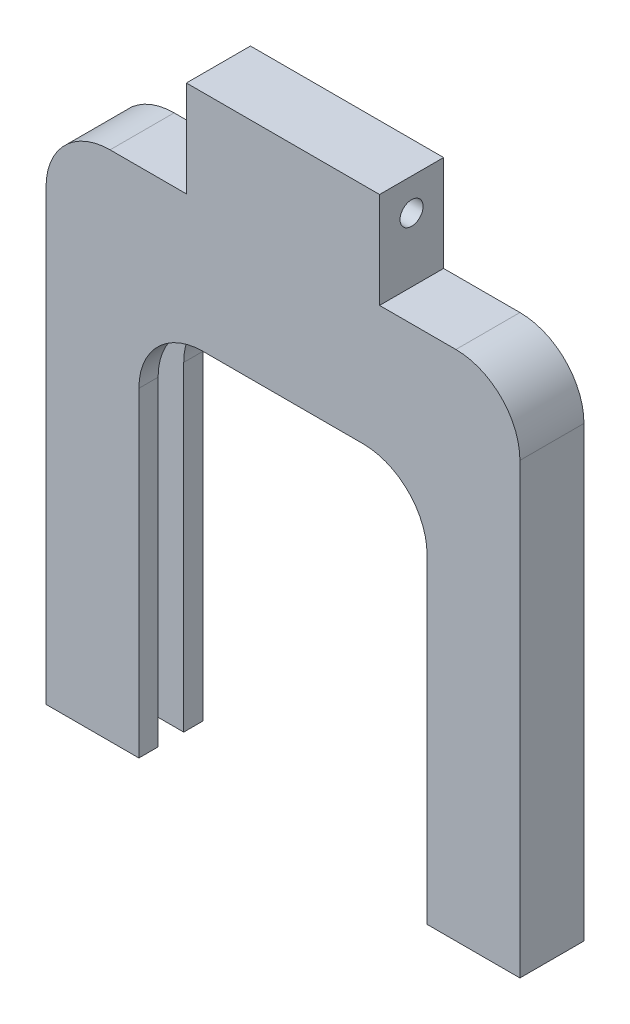
ISO-10303-21;
HEADER;
FILE_DESCRIPTION(('STEP AP214'),'2;1');
FILE_NAME('part.step','',(''),(''),'','','');
FILE_SCHEMA(('AUTOMOTIVE_DESIGN { 1 0 10303 214 1 1 1 1 }'));
ENDSEC;
DATA;
#1=APPLICATION_CONTEXT('core data for automotive mechanical design processes');
#2=APPLICATION_PROTOCOL_DEFINITION('international standard','automotive_design',2000,#1);
#3=PRODUCT_CONTEXT('',#1,'mechanical');
#4=PRODUCT('Part','Part','',(#3));
#5=PRODUCT_RELATED_PRODUCT_CATEGORY('part','',(#4));
#6=PRODUCT_DEFINITION_FORMATION('','',#4);
#7=PRODUCT_DEFINITION_CONTEXT('part definition',#1,'design');
#8=PRODUCT_DEFINITION('design','',#6,#7);
#9=PRODUCT_DEFINITION_SHAPE('','',#8);
#10=(LENGTH_UNIT() NAMED_UNIT(*) SI_UNIT(.MILLI.,.METRE.));
#11=(NAMED_UNIT(*) PLANE_ANGLE_UNIT() SI_UNIT($,.RADIAN.));
#12=(NAMED_UNIT(*) SI_UNIT($,.STERADIAN.) SOLID_ANGLE_UNIT());
#13=UNCERTAINTY_MEASURE_WITH_UNIT(LENGTH_MEASURE(1.E-05),#10,'distance_accuracy_value','');
#14=(GEOMETRIC_REPRESENTATION_CONTEXT(3) GLOBAL_UNCERTAINTY_ASSIGNED_CONTEXT((#13)) GLOBAL_UNIT_ASSIGNED_CONTEXT((#10,
#11,#12)) REPRESENTATION_CONTEXT('',''));
#15=CARTESIAN_POINT('',(0.,0.,0.));
#16=DIRECTION('',(0.,0.,1.));
#17=DIRECTION('',(1.,0.,0.));
#18=AXIS2_PLACEMENT_3D('',#15,#16,#17);
#19=CARTESIAN_POINT('',(12.5,10.,0.));
#20=DIRECTION('',(0.,0.,-1.));
#21=DIRECTION('',(-1.,0.,0.));
#22=AXIS2_PLACEMENT_3D('',#19,#20,#21);
#23=CYLINDRICAL_SURFACE('',#22,10.);
#24=DIRECTION('',(0.,0.,1.));
#25=VECTOR('',#24,1.);
#26=CARTESIAN_POINT('',(12.5,20.,0.));
#27=LINE('',#26,#25);
#28=CARTESIAN_POINT('',(12.5,20.,0.));
#29=VERTEX_POINT('',#28);
#30=CARTESIAN_POINT('',(12.5,20.,3.));
#31=VERTEX_POINT('',#30);
#32=EDGE_CURVE('E389',#29,#31,#27,.T.);
#33=ORIENTED_EDGE('',*,*,#32,.F.);
#34=CARTESIAN_POINT('',(12.5,10.,0.));
#35=DIRECTION('',(0.,0.,1.));
#36=DIRECTION('',(1.,0.,0.));
#37=AXIS2_PLACEMENT_3D('',#34,#35,#36);
#38=CIRCLE('',#37,10.);
#39=CARTESIAN_POINT('',(22.5,10.,0.));
#40=VERTEX_POINT('',#39);
#41=EDGE_CURVE('E44',#29,#40,#38,.F.);
#42=ORIENTED_EDGE('',*,*,#41,.T.);
#43=DIRECTION('',(0.,0.,1.));
#44=VECTOR('',#43,1.);
#45=CARTESIAN_POINT('',(22.5,10.,0.));
#46=LINE('',#45,#44);
#47=CARTESIAN_POINT('',(22.5,10.,3.));
#48=VERTEX_POINT('',#47);
#49=EDGE_CURVE('E392',#48,#40,#46,.F.);
#50=ORIENTED_EDGE('',*,*,#49,.F.);
#51=CARTESIAN_POINT('',(12.5,10.,3.));
#52=DIRECTION('',(0.,0.,-1.));
#53=DIRECTION('',(-1.,0.,0.));
#54=AXIS2_PLACEMENT_3D('',#51,#52,#53);
#55=CIRCLE('',#54,10.);
#56=EDGE_CURVE('E11',#48,#31,#55,.F.);
#57=ORIENTED_EDGE('',*,*,#56,.T.);
#58=EDGE_LOOP('',(#33,#42,#50,#57));
#59=FACE_BOUND('',#58,.T.);
#60=ADVANCED_FACE('F37',(#59),#23,.F.);
#61=CARTESIAN_POINT('',(12.5,10.,0.));
#62=DIRECTION('',(0.,0.,-1.));
#63=DIRECTION('',(-1.,0.,0.));
#64=AXIS2_PLACEMENT_3D('',#61,#62,#63);
#65=CYLINDRICAL_SURFACE('',#64,10.);
#66=DIRECTION('',(0.,0.,1.));
#67=VECTOR('',#66,1.);
#68=CARTESIAN_POINT('',(12.5,20.,0.));
#69=LINE('',#68,#67);
#70=CARTESIAN_POINT('',(12.5,20.,7.));
#71=VERTEX_POINT('',#70);
#72=CARTESIAN_POINT('',(12.5,20.,10.));
#73=VERTEX_POINT('',#72);
#74=EDGE_CURVE('E379',#71,#73,#69,.T.);
#75=ORIENTED_EDGE('',*,*,#74,.F.);
#76=CARTESIAN_POINT('',(12.5,10.,7.));
#77=DIRECTION('',(0.,0.,1.));
#78=DIRECTION('',(1.,0.,0.));
#79=AXIS2_PLACEMENT_3D('',#76,#77,#78);
#80=CIRCLE('',#79,10.);
#81=CARTESIAN_POINT('',(22.5,10.,7.));
#82=VERTEX_POINT('',#81);
#83=EDGE_CURVE('E385',#71,#82,#80,.F.);
#84=ORIENTED_EDGE('',*,*,#83,.T.);
#85=DIRECTION('',(0.,0.,1.));
#86=VECTOR('',#85,1.);
#87=CARTESIAN_POINT('',(22.5,10.,0.));
#88=LINE('',#87,#86);
#89=CARTESIAN_POINT('',(22.5,10.,10.));
#90=VERTEX_POINT('',#89);
#91=EDGE_CURVE('E382',#90,#82,#88,.F.);
#92=ORIENTED_EDGE('',*,*,#91,.F.);
#93=CARTESIAN_POINT('',(12.5,10.,10.));
#94=DIRECTION('',(0.,0.,1.));
#95=DIRECTION('',(1.,0.,0.));
#96=AXIS2_PLACEMENT_3D('',#93,#94,#95);
#97=CIRCLE('',#96,10.);
#98=EDGE_CURVE('E387',#90,#73,#97,.T.);
#99=ORIENTED_EDGE('',*,*,#98,.T.);
#100=EDGE_LOOP('',(#75,#84,#92,#99));
#101=FACE_BOUND('',#100,.T.);
#102=ADVANCED_FACE('F483',(#101),#65,.F.);
#103=CARTESIAN_POINT('',(-12.5,10.,0.));
#104=DIRECTION('',(0.,0.,1.));
#105=DIRECTION('',(1.,0.,0.));
#106=AXIS2_PLACEMENT_3D('',#103,#104,#105);
#107=CYLINDRICAL_SURFACE('',#106,10.);
#108=DIRECTION('',(0.,0.,-1.));
#109=VECTOR('',#108,1.);
#110=CARTESIAN_POINT('',(-12.5,20.,0.));
#111=LINE('',#110,#109);
#112=CARTESIAN_POINT('',(-12.5,20.,3.));
#113=VERTEX_POINT('',#112);
#114=CARTESIAN_POINT('',(-12.5,20.,0.));
#115=VERTEX_POINT('',#114);
#116=EDGE_CURVE('E368',#113,#115,#111,.T.);
#117=ORIENTED_EDGE('',*,*,#116,.F.);
#118=CARTESIAN_POINT('',(-12.5,10.,3.));
#119=DIRECTION('',(0.,0.,-1.));
#120=DIRECTION('',(-1.,0.,0.));
#121=AXIS2_PLACEMENT_3D('',#118,#119,#120);
#122=CIRCLE('',#121,10.);
#123=CARTESIAN_POINT('',(-22.5,9.99999999999999,3.));
#124=VERTEX_POINT('',#123);
#125=EDGE_CURVE('E374',#113,#124,#122,.F.);
#126=ORIENTED_EDGE('',*,*,#125,.T.);
#127=DIRECTION('',(0.,0.,-1.));
#128=VECTOR('',#127,1.);
#129=CARTESIAN_POINT('',(-22.5,9.99999999999999,0.));
#130=LINE('',#129,#128);
#131=CARTESIAN_POINT('',(-22.5,9.99999999999999,0.));
#132=VERTEX_POINT('',#131);
#133=EDGE_CURVE('E371',#132,#124,#130,.F.);
#134=ORIENTED_EDGE('',*,*,#133,.F.);
#135=CARTESIAN_POINT('',(-12.5,10.,0.));
#136=DIRECTION('',(0.,0.,1.));
#137=DIRECTION('',(1.,0.,0.));
#138=AXIS2_PLACEMENT_3D('',#135,#136,#137);
#139=CIRCLE('',#138,10.);
#140=EDGE_CURVE('E376',#132,#115,#139,.F.);
#141=ORIENTED_EDGE('',*,*,#140,.T.);
#142=EDGE_LOOP('',(#117,#126,#134,#141));
#143=FACE_BOUND('',#142,.T.);
#144=ADVANCED_FACE('F432',(#143),#107,.F.);
#145=CARTESIAN_POINT('',(-12.5,10.,0.));
#146=DIRECTION('',(0.,0.,1.));
#147=DIRECTION('',(1.,0.,0.));
#148=AXIS2_PLACEMENT_3D('',#145,#146,#147);
#149=CYLINDRICAL_SURFACE('',#148,10.);
#150=DIRECTION('',(0.,0.,-1.));
#151=VECTOR('',#150,1.);
#152=CARTESIAN_POINT('',(-12.5,20.,0.));
#153=LINE('',#152,#151);
#154=CARTESIAN_POINT('',(-12.5,20.,10.));
#155=VERTEX_POINT('',#154);
#156=CARTESIAN_POINT('',(-12.5,20.,7.));
#157=VERTEX_POINT('',#156);
#158=EDGE_CURVE('E353',#155,#157,#153,.T.);
#159=ORIENTED_EDGE('',*,*,#158,.F.);
#160=CARTESIAN_POINT('',(-12.5,10.,10.));
#161=DIRECTION('',(0.,0.,1.));
#162=DIRECTION('',(1.,0.,0.));
#163=AXIS2_PLACEMENT_3D('',#160,#161,#162);
#164=CIRCLE('',#163,10.);
#165=CARTESIAN_POINT('',(-22.5,9.99999999999999,10.));
#166=VERTEX_POINT('',#165);
#167=EDGE_CURVE('E363',#155,#166,#164,.T.);
#168=ORIENTED_EDGE('',*,*,#167,.T.);
#169=DIRECTION('',(0.,0.,-1.));
#170=VECTOR('',#169,1.);
#171=CARTESIAN_POINT('',(-22.5,9.99999999999999,0.));
#172=LINE('',#171,#170);
#173=CARTESIAN_POINT('',(-22.5,9.99999999999999,7.));
#174=VERTEX_POINT('',#173);
#175=EDGE_CURVE('E360',#174,#166,#172,.F.);
#176=ORIENTED_EDGE('',*,*,#175,.F.);
#177=CARTESIAN_POINT('',(-12.5,10.,7.));
#178=DIRECTION('',(0.,0.,1.));
#179=DIRECTION('',(1.,0.,0.));
#180=AXIS2_PLACEMENT_3D('',#177,#178,#179);
#181=CIRCLE('',#180,10.);
#182=EDGE_CURVE('E365',#174,#157,#181,.F.);
#183=ORIENTED_EDGE('',*,*,#182,.T.);
#184=EDGE_LOOP('',(#159,#168,#176,#183));
#185=FACE_BOUND('',#184,.T.);
#186=ADVANCED_FACE('F491',(#185),#149,.F.);
#187=CARTESIAN_POINT('',(27.,30.,10.));
#188=DIRECTION('',(0.,0.,1.));
#189=DIRECTION('',(1.,0.,0.));
#190=AXIS2_PLACEMENT_3D('',#187,#188,#189);
#191=CYLINDRICAL_SURFACE('',#190,10.);
#192=DIRECTION('',(0.,0.,1.));
#193=VECTOR('',#192,1.);
#194=CARTESIAN_POINT('',(37.,30.,10.));
#195=LINE('',#194,#193);
#196=CARTESIAN_POINT('',(37.,30.,0.));
#197=VERTEX_POINT('',#196);
#198=CARTESIAN_POINT('',(37.,30.,10.));
#199=VERTEX_POINT('',#198);
#200=EDGE_CURVE('E343',#197,#199,#195,.T.);
#201=ORIENTED_EDGE('',*,*,#200,.F.);
#202=CARTESIAN_POINT('',(27.,30.,0.));
#203=DIRECTION('',(0.,0.,1.));
#204=DIRECTION('',(1.,0.,0.));
#205=AXIS2_PLACEMENT_3D('',#202,#203,#204);
#206=CIRCLE('',#205,10.);
#207=CARTESIAN_POINT('',(27.,40.,0.));
#208=VERTEX_POINT('',#207);
#209=EDGE_CURVE('E349',#208,#197,#206,.F.);
#210=ORIENTED_EDGE('',*,*,#209,.F.);
#211=DIRECTION('',(0.,0.,1.));
#212=VECTOR('',#211,1.);
#213=CARTESIAN_POINT('',(27.,40.,10.));
#214=LINE('',#213,#212);
#215=CARTESIAN_POINT('',(27.,40.,10.));
#216=VERTEX_POINT('',#215);
#217=EDGE_CURVE('E346',#216,#208,#214,.F.);
#218=ORIENTED_EDGE('',*,*,#217,.F.);
#219=CARTESIAN_POINT('',(27.,30.,10.));
#220=DIRECTION('',(0.,0.,1.));
#221=DIRECTION('',(1.,0.,0.));
#222=AXIS2_PLACEMENT_3D('',#219,#220,#221);
#223=CIRCLE('',#222,10.);
#224=EDGE_CURVE('E351',#199,#216,#223,.T.);
#225=ORIENTED_EDGE('',*,*,#224,.F.);
#226=EDGE_LOOP('',(#201,#210,#218,#225));
#227=FACE_BOUND('',#226,.T.);
#228=ADVANCED_FACE('F497',(#227),#191,.T.);
#229=CARTESIAN_POINT('',(-27.,30.,10.));
#230=DIRECTION('',(0.,0.,-1.));
#231=DIRECTION('',(-1.,0.,0.));
#232=AXIS2_PLACEMENT_3D('',#229,#230,#231);
#233=CYLINDRICAL_SURFACE('',#232,10.);
#234=DIRECTION('',(0.,0.,-1.));
#235=VECTOR('',#234,1.);
#236=CARTESIAN_POINT('',(-37.,30.,10.));
#237=LINE('',#236,#235);
#238=CARTESIAN_POINT('',(-37.,30.,10.));
#239=VERTEX_POINT('',#238);
#240=CARTESIAN_POINT('',(-37.,30.,0.));
#241=VERTEX_POINT('',#240);
#242=EDGE_CURVE('E333',#239,#241,#237,.T.);
#243=ORIENTED_EDGE('',*,*,#242,.F.);
#244=CARTESIAN_POINT('',(-27.,30.,10.));
#245=DIRECTION('',(0.,0.,1.));
#246=DIRECTION('',(1.,0.,0.));
#247=AXIS2_PLACEMENT_3D('',#244,#245,#246);
#248=CIRCLE('',#247,10.);
#249=CARTESIAN_POINT('',(-27.,40.,10.));
#250=VERTEX_POINT('',#249);
#251=EDGE_CURVE('E339',#250,#239,#248,.T.);
#252=ORIENTED_EDGE('',*,*,#251,.F.);
#253=DIRECTION('',(0.,0.,-1.));
#254=VECTOR('',#253,1.);
#255=CARTESIAN_POINT('',(-27.,40.,10.));
#256=LINE('',#255,#254);
#257=CARTESIAN_POINT('',(-27.,40.,0.));
#258=VERTEX_POINT('',#257);
#259=EDGE_CURVE('E336',#258,#250,#256,.F.);
#260=ORIENTED_EDGE('',*,*,#259,.F.);
#261=CARTESIAN_POINT('',(-27.,30.,0.));
#262=DIRECTION('',(0.,0.,1.));
#263=DIRECTION('',(1.,0.,0.));
#264=AXIS2_PLACEMENT_3D('',#261,#262,#263);
#265=CIRCLE('',#264,10.);
#266=EDGE_CURVE('E341',#241,#258,#265,.F.);
#267=ORIENTED_EDGE('',*,*,#266,.F.);
#268=EDGE_LOOP('',(#243,#252,#260,#267));
#269=FACE_BOUND('',#268,.T.);
#270=ADVANCED_FACE('F451',(#269),#233,.T.);
#271=CARTESIAN_POINT('',(-37.,40.,10.));
#272=DIRECTION('',(0.,-1.,0.));
#273=DIRECTION('',(0.,0.,-1.));
#274=AXIS2_PLACEMENT_3D('',#271,#272,#273);
#275=PLANE('',#274);
#276=DIRECTION('',(-1.,0.,0.));
#277=VECTOR('',#276,1.);
#278=CARTESIAN_POINT('',(-37.,40.,0.));
#279=LINE('',#278,#277);
#280=CARTESIAN_POINT('',(-15.0820439629309,40.,0.));
#281=VERTEX_POINT('',#280);
#282=EDGE_CURVE('E320',#281,#258,#279,.T.);
#283=ORIENTED_EDGE('',*,*,#282,.T.);
#284=ORIENTED_EDGE('',*,*,#259,.T.);
#285=DIRECTION('',(-1.,0.,0.));
#286=VECTOR('',#285,1.);
#287=CARTESIAN_POINT('',(-37.,40.,10.));
#288=LINE('',#287,#286);
#289=CARTESIAN_POINT('',(-15.0820439629309,40.,10.));
#290=VERTEX_POINT('',#289);
#291=EDGE_CURVE('E307',#290,#250,#288,.T.);
#292=ORIENTED_EDGE('',*,*,#291,.F.);
#293=DIRECTION('',(0.,0.,1.));
#294=VECTOR('',#293,1.);
#295=CARTESIAN_POINT('',(-15.0820439629309,40.,0.));
#296=LINE('',#295,#294);
#297=EDGE_CURVE('E231',#281,#290,#296,.T.);
#298=ORIENTED_EDGE('',*,*,#297,.F.);
#299=EDGE_LOOP('',(#283,#284,#292,#298));
#300=FACE_BOUND('',#299,.T.);
#301=ADVANCED_FACE('F504',(#300),#275,.F.);
#302=CARTESIAN_POINT('',(15.0820439629309,40.,10.));
#303=VERTEX_POINT('',#302);
#304=EDGE_CURVE('E309',#216,#303,#288,.T.);
#305=ORIENTED_EDGE('',*,*,#304,.F.);
#306=ORIENTED_EDGE('',*,*,#217,.T.);
#307=CARTESIAN_POINT('',(15.0820439629309,40.,0.));
#308=VERTEX_POINT('',#307);
#309=EDGE_CURVE('E321',#208,#308,#279,.T.);
#310=ORIENTED_EDGE('',*,*,#309,.T.);
#311=DIRECTION('',(0.,0.,-1.));
#312=VECTOR('',#311,1.);
#313=CARTESIAN_POINT('',(15.0820439629309,40.,0.));
#314=LINE('',#313,#312);
#315=EDGE_CURVE('E228',#303,#308,#314,.T.);
#316=ORIENTED_EDGE('',*,*,#315,.F.);
#317=EDGE_LOOP('',(#305,#306,#310,#316));
#318=FACE_BOUND('',#317,.T.);
#319=ADVANCED_FACE('F510',(#318),#275,.F.);
#320=CARTESIAN_POINT('',(-37.,-40.,10.));
#321=DIRECTION('',(0.,1.,0.));
#322=DIRECTION('',(0.,0.,1.));
#323=AXIS2_PLACEMENT_3D('',#320,#321,#322);
#324=PLANE('',#323);
#325=DIRECTION('',(1.,0.,0.));
#326=VECTOR('',#325,1.);
#327=CARTESIAN_POINT('',(-37.,-40.,0.));
#328=LINE('',#327,#326);
#329=CARTESIAN_POINT('',(-37.,-40.,0.));
#330=VERTEX_POINT('',#329);
#331=CARTESIAN_POINT('',(-22.5,-40.,0.));
#332=VERTEX_POINT('',#331);
#333=EDGE_CURVE('E308',#330,#332,#328,.T.);
#334=ORIENTED_EDGE('',*,*,#333,.T.);
#335=DIRECTION('',(0.,0.,1.));
#336=VECTOR('',#335,1.);
#337=CARTESIAN_POINT('',(-22.5,-40.,-29.));
#338=LINE('',#337,#336);
#339=CARTESIAN_POINT('',(-22.5,-40.,3.));
#340=VERTEX_POINT('',#339);
#341=EDGE_CURVE('E248',#332,#340,#338,.T.);
#342=ORIENTED_EDGE('',*,*,#341,.T.);
#343=DIRECTION('',(1.,0.,0.));
#344=VECTOR('',#343,1.);
#345=CARTESIAN_POINT('',(-32.9,-40.,3.));
#346=LINE('',#345,#344);
#347=CARTESIAN_POINT('',(-32.9,-40.,3.));
#348=VERTEX_POINT('',#347);
#349=EDGE_CURVE('E273',#348,#340,#346,.T.);
#350=ORIENTED_EDGE('',*,*,#349,.F.);
#351=DIRECTION('',(0.,0.,-1.));
#352=VECTOR('',#351,1.);
#353=CARTESIAN_POINT('',(-32.9,-40.,3.));
#354=LINE('',#353,#352);
#355=CARTESIAN_POINT('',(-32.9,-40.,7.));
#356=VERTEX_POINT('',#355);
#357=EDGE_CURVE('E288',#356,#348,#354,.T.);
#358=ORIENTED_EDGE('',*,*,#357,.F.);
#359=DIRECTION('',(-1.,0.,0.));
#360=VECTOR('',#359,1.);
#361=CARTESIAN_POINT('',(-32.9,-40.,7.));
#362=LINE('',#361,#360);
#363=CARTESIAN_POINT('',(-22.5,-40.,7.));
#364=VERTEX_POINT('',#363);
#365=EDGE_CURVE('E284',#364,#356,#362,.T.);
#366=ORIENTED_EDGE('',*,*,#365,.F.);
#367=CARTESIAN_POINT('',(-22.5,-40.,10.));
#368=VERTEX_POINT('',#367);
#369=EDGE_CURVE('E244',#364,#368,#338,.T.);
#370=ORIENTED_EDGE('',*,*,#369,.T.);
#371=DIRECTION('',(1.,0.,0.));
#372=VECTOR('',#371,1.);
#373=CARTESIAN_POINT('',(-37.,-40.,10.));
#374=LINE('',#373,#372);
#375=CARTESIAN_POINT('',(-37.,-40.,10.));
#376=VERTEX_POINT('',#375);
#377=EDGE_CURVE('E314',#376,#368,#374,.T.);
#378=ORIENTED_EDGE('',*,*,#377,.F.);
#379=DIRECTION('',(0.,0.,-1.));
#380=VECTOR('',#379,1.);
#381=CARTESIAN_POINT('',(-37.,-40.,10.));
#382=LINE('',#381,#380);
#383=EDGE_CURVE('E330',#376,#330,#382,.T.);
#384=ORIENTED_EDGE('',*,*,#383,.T.);
#385=EDGE_LOOP('',(#334,#342,#350,#358,#366,#370,#378,#384));
#386=FACE_BOUND('',#385,.T.);
#387=ADVANCED_FACE('F442',(#386),#324,.F.);
#388=CARTESIAN_POINT('',(-32.9,20.,3.));
#389=DIRECTION('',(0.,0.,-1.));
#390=DIRECTION('',(-1.,0.,0.));
#391=AXIS2_PLACEMENT_3D('',#388,#389,#390);
#392=PLANE('',#391);
#393=ORIENTED_EDGE('',*,*,#349,.T.);
#394=DIRECTION('',(0.,1.,0.));
#395=VECTOR('',#394,1.);
#396=CARTESIAN_POINT('',(-22.5,20.,3.));
#397=LINE('',#396,#395);
#398=EDGE_CURVE('E261',#340,#124,#397,.T.);
#399=ORIENTED_EDGE('',*,*,#398,.T.);
#400=ORIENTED_EDGE('',*,*,#125,.F.);
#401=DIRECTION('',(1.,0.,0.));
#402=VECTOR('',#401,1.);
#403=CARTESIAN_POINT('',(-32.9,20.,3.));
#404=LINE('',#403,#402);
#405=CARTESIAN_POINT('',(-32.9,20.,3.));
#406=VERTEX_POINT('',#405);
#407=EDGE_CURVE('E280',#406,#113,#404,.T.);
#408=ORIENTED_EDGE('',*,*,#407,.F.);
#409=DIRECTION('',(0.,-1.,0.));
#410=VECTOR('',#409,1.);
#411=CARTESIAN_POINT('',(-32.9,20.,3.));
#412=LINE('',#411,#410);
#413=EDGE_CURVE('E298',#406,#348,#412,.T.);
#414=ORIENTED_EDGE('',*,*,#413,.T.);
#415=EDGE_LOOP('',(#393,#399,#400,#408,#414));
#416=FACE_BOUND('',#415,.T.);
#417=ADVANCED_FACE('F529',(#416),#392,.F.);
#418=CARTESIAN_POINT('',(-32.9,20.,7.));
#419=DIRECTION('',(0.,0.,1.));
#420=DIRECTION('',(1.,0.,0.));
#421=AXIS2_PLACEMENT_3D('',#418,#419,#420);
#422=PLANE('',#421);
#423=DIRECTION('',(-1.,0.,0.));
#424=VECTOR('',#423,1.);
#425=CARTESIAN_POINT('',(-32.9,20.,7.));
#426=LINE('',#425,#424);
#427=CARTESIAN_POINT('',(-32.9,20.,7.));
#428=VERTEX_POINT('',#427);
#429=EDGE_CURVE('E272',#157,#428,#426,.T.);
#430=ORIENTED_EDGE('',*,*,#429,.F.);
#431=ORIENTED_EDGE('',*,*,#182,.F.);
#432=DIRECTION('',(0.,-1.,0.));
#433=VECTOR('',#432,1.);
#434=CARTESIAN_POINT('',(-22.5,20.,7.));
#435=LINE('',#434,#433);
#436=EDGE_CURVE('E259',#174,#364,#435,.T.);
#437=ORIENTED_EDGE('',*,*,#436,.T.);
#438=ORIENTED_EDGE('',*,*,#365,.T.);
#439=DIRECTION('',(0.,-1.,0.));
#440=VECTOR('',#439,1.);
#441=CARTESIAN_POINT('',(-32.9,20.,7.));
#442=LINE('',#441,#440);
#443=EDGE_CURVE('E300',#428,#356,#442,.T.);
#444=ORIENTED_EDGE('',*,*,#443,.F.);
#445=EDGE_LOOP('',(#430,#431,#437,#438,#444));
#446=FACE_BOUND('',#445,.T.);
#447=ADVANCED_FACE('F507',(#446),#422,.F.);
#448=CARTESIAN_POINT('',(37.,40.,10.));
#449=DIRECTION('',(-1.,0.,0.));
#450=DIRECTION('',(0.,-1.,0.));
#451=AXIS2_PLACEMENT_3D('',#448,#449,#450);
#452=PLANE('',#451);
#453=DIRECTION('',(0.,1.,0.));
#454=VECTOR('',#453,1.);
#455=CARTESIAN_POINT('',(37.,40.,0.));
#456=LINE('',#455,#454);
#457=CARTESIAN_POINT('',(37.,-40.,0.));
#458=VERTEX_POINT('',#457);
#459=EDGE_CURVE('E297',#458,#197,#456,.T.);
#460=ORIENTED_EDGE('',*,*,#459,.T.);
#461=ORIENTED_EDGE('',*,*,#200,.T.);
#462=DIRECTION('',(0.,1.,0.));
#463=VECTOR('',#462,1.);
#464=CARTESIAN_POINT('',(37.,40.,10.));
#465=LINE('',#464,#463);
#466=CARTESIAN_POINT('',(37.,-40.,10.));
#467=VERTEX_POINT('',#466);
#468=EDGE_CURVE('E305',#467,#199,#465,.T.);
#469=ORIENTED_EDGE('',*,*,#468,.F.);
#470=DIRECTION('',(0.,0.,-1.));
#471=VECTOR('',#470,1.);
#472=CARTESIAN_POINT('',(37.,-40.,10.));
#473=LINE('',#472,#471);
#474=EDGE_CURVE('E317',#467,#458,#473,.T.);
#475=ORIENTED_EDGE('',*,*,#474,.T.);
#476=EDGE_LOOP('',(#460,#461,#469,#475));
#477=FACE_BOUND('',#476,.T.);
#478=ADVANCED_FACE('F409',(#477),#452,.F.);
#479=CARTESIAN_POINT('',(-37.,40.,10.));
#480=DIRECTION('',(1.,0.,0.));
#481=DIRECTION('',(0.,1.,0.));
#482=AXIS2_PLACEMENT_3D('',#479,#480,#481);
#483=PLANE('',#482);
#484=DIRECTION('',(0.,-1.,0.));
#485=VECTOR('',#484,1.);
#486=CARTESIAN_POINT('',(-37.,40.,10.));
#487=LINE('',#486,#485);
#488=EDGE_CURVE('E311',#239,#376,#487,.T.);
#489=ORIENTED_EDGE('',*,*,#488,.F.);
#490=ORIENTED_EDGE('',*,*,#242,.T.);
#491=DIRECTION('',(0.,-1.,0.));
#492=VECTOR('',#491,1.);
#493=CARTESIAN_POINT('',(-37.,40.,0.));
#494=LINE('',#493,#492);
#495=EDGE_CURVE('E323',#241,#330,#494,.T.);
#496=ORIENTED_EDGE('',*,*,#495,.T.);
#497=ORIENTED_EDGE('',*,*,#383,.F.);
#498=EDGE_LOOP('',(#489,#490,#496,#497));
#499=FACE_BOUND('',#498,.T.);
#500=ADVANCED_FACE('F448',(#499),#483,.F.);
#501=CARTESIAN_POINT('',(22.5,-40.,10.));
#502=VERTEX_POINT('',#501);
#503=EDGE_CURVE('E313',#502,#467,#374,.T.);
#504=ORIENTED_EDGE('',*,*,#503,.F.);
#505=DIRECTION('',(0.,0.,1.));
#506=VECTOR('',#505,1.);
#507=CARTESIAN_POINT('',(22.5,-40.,-29.));
#508=LINE('',#507,#506);
#509=CARTESIAN_POINT('',(22.5,-40.,7.));
#510=VERTEX_POINT('',#509);
#511=EDGE_CURVE('E245',#510,#502,#508,.T.);
#512=ORIENTED_EDGE('',*,*,#511,.F.);
#513=CARTESIAN_POINT('',(32.9,-40.,7.));
#514=VERTEX_POINT('',#513);
#515=EDGE_CURVE('E285',#514,#510,#362,.T.);
#516=ORIENTED_EDGE('',*,*,#515,.F.);
#517=DIRECTION('',(0.,0.,1.));
#518=VECTOR('',#517,1.);
#519=CARTESIAN_POINT('',(32.9,-40.,3.));
#520=LINE('',#519,#518);
#521=CARTESIAN_POINT('',(32.9,-40.,3.));
#522=VERTEX_POINT('',#521);
#523=EDGE_CURVE('E268',#522,#514,#520,.T.);
#524=ORIENTED_EDGE('',*,*,#523,.F.);
#525=CARTESIAN_POINT('',(22.5,-40.,3.));
#526=VERTEX_POINT('',#525);
#527=EDGE_CURVE('E291',#526,#522,#346,.T.);
#528=ORIENTED_EDGE('',*,*,#527,.F.);
#529=CARTESIAN_POINT('',(22.5,-40.,0.));
#530=VERTEX_POINT('',#529);
#531=EDGE_CURVE('E247',#530,#526,#508,.T.);
#532=ORIENTED_EDGE('',*,*,#531,.F.);
#533=EDGE_CURVE('E325',#530,#458,#328,.T.);
#534=ORIENTED_EDGE('',*,*,#533,.T.);
#535=ORIENTED_EDGE('',*,*,#474,.F.);
#536=EDGE_LOOP('',(#504,#512,#516,#524,#528,#532,#534,#535));
#537=FACE_BOUND('',#536,.T.);
#538=ADVANCED_FACE('F405',(#537),#324,.F.);
#539=CARTESIAN_POINT('',(0.,0.,10.));
#540=DIRECTION('',(0.,0.,1.));
#541=DIRECTION('',(1.,0.,0.));
#542=AXIS2_PLACEMENT_3D('',#539,#540,#541);
#543=PLANE('',#542);
#544=ORIENTED_EDGE('',*,*,#468,.T.);
#545=ORIENTED_EDGE('',*,*,#224,.T.);
#546=ORIENTED_EDGE('',*,*,#304,.T.);
#547=DIRECTION('',(0.,-1.,0.));
#548=VECTOR('',#547,1.);
#549=CARTESIAN_POINT('',(15.0820439629309,55.,10.));
#550=LINE('',#549,#548);
#551=CARTESIAN_POINT('',(15.0820439629309,55.,10.));
#552=VERTEX_POINT('',#551);
#553=EDGE_CURVE('E215',#552,#303,#550,.T.);
#554=ORIENTED_EDGE('',*,*,#553,.F.);
#555=DIRECTION('',(1.,0.,0.));
#556=VECTOR('',#555,1.);
#557=CARTESIAN_POINT('',(15.0820439629309,55.,10.));
#558=LINE('',#557,#556);
#559=CARTESIAN_POINT('',(-15.0820439629309,55.,10.));
#560=VERTEX_POINT('',#559);
#561=EDGE_CURVE('E206',#560,#552,#558,.T.);
#562=ORIENTED_EDGE('',*,*,#561,.F.);
#563=DIRECTION('',(0.,-1.,0.));
#564=VECTOR('',#563,1.);
#565=CARTESIAN_POINT('',(-15.0820439629309,55.,10.));
#566=LINE('',#565,#564);
#567=EDGE_CURVE('E212',#560,#290,#566,.T.);
#568=ORIENTED_EDGE('',*,*,#567,.T.);
#569=ORIENTED_EDGE('',*,*,#291,.T.);
#570=ORIENTED_EDGE('',*,*,#251,.T.);
#571=ORIENTED_EDGE('',*,*,#488,.T.);
#572=ORIENTED_EDGE('',*,*,#377,.T.);
#573=DIRECTION('',(0.,-1.,0.));
#574=VECTOR('',#573,1.);
#575=CARTESIAN_POINT('',(-22.5,20.,10.));
#576=LINE('',#575,#574);
#577=EDGE_CURVE('E232',#166,#368,#576,.T.);
#578=ORIENTED_EDGE('',*,*,#577,.F.);
#579=ORIENTED_EDGE('',*,*,#167,.F.);
#580=DIRECTION('',(-1.,0.,0.));
#581=VECTOR('',#580,1.);
#582=CARTESIAN_POINT('',(22.5,20.,10.));
#583=LINE('',#582,#581);
#584=EDGE_CURVE('E242',#73,#155,#583,.T.);
#585=ORIENTED_EDGE('',*,*,#584,.F.);
#586=ORIENTED_EDGE('',*,*,#98,.F.);
#587=DIRECTION('',(0.,1.,0.));
#588=VECTOR('',#587,1.);
#589=CARTESIAN_POINT('',(22.5,-40.,10.));
#590=LINE('',#589,#588);
#591=EDGE_CURVE('E234',#502,#90,#590,.T.);
#592=ORIENTED_EDGE('',*,*,#591,.F.);
#593=ORIENTED_EDGE('',*,*,#503,.T.);
#594=EDGE_LOOP('',(#544,#545,#546,#554,#562,#568,#569,#570,#571,#572,#578,#579,#585,#586,#592,#593));
#595=FACE_BOUND('',#594,.T.);
#596=ADVANCED_FACE('F209',(#595),#543,.T.);
#597=CARTESIAN_POINT('',(0.,0.,0.));
#598=DIRECTION('',(0.,0.,1.));
#599=DIRECTION('',(1.,0.,0.));
#600=AXIS2_PLACEMENT_3D('',#597,#598,#599);
#601=PLANE('',#600);
#602=ORIENTED_EDGE('',*,*,#41,.F.);
#603=DIRECTION('',(-1.,0.,0.));
#604=VECTOR('',#603,1.);
#605=CARTESIAN_POINT('',(0.,20.,0.));
#606=LINE('',#605,#604);
#607=EDGE_CURVE('E266',#29,#115,#606,.T.);
#608=ORIENTED_EDGE('',*,*,#607,.T.);
#609=ORIENTED_EDGE('',*,*,#140,.F.);
#610=DIRECTION('',(0.,-1.,0.));
#611=VECTOR('',#610,1.);
#612=CARTESIAN_POINT('',(-22.5,0.,0.));
#613=LINE('',#612,#611);
#614=EDGE_CURVE('E264',#132,#332,#613,.T.);
#615=ORIENTED_EDGE('',*,*,#614,.T.);
#616=ORIENTED_EDGE('',*,*,#333,.F.);
#617=ORIENTED_EDGE('',*,*,#495,.F.);
#618=ORIENTED_EDGE('',*,*,#266,.T.);
#619=ORIENTED_EDGE('',*,*,#282,.F.);
#620=DIRECTION('',(0.,-1.,0.));
#621=VECTOR('',#620,1.);
#622=CARTESIAN_POINT('',(-15.0820439629309,55.,0.));
#623=LINE('',#622,#621);
#624=CARTESIAN_POINT('',(-15.0820439629309,55.,0.));
#625=VERTEX_POINT('',#624);
#626=EDGE_CURVE('E455',#625,#281,#623,.T.);
#627=ORIENTED_EDGE('',*,*,#626,.F.);
#628=DIRECTION('',(-1.,0.,0.));
#629=VECTOR('',#628,1.);
#630=CARTESIAN_POINT('',(15.0820439629309,55.,0.));
#631=LINE('',#630,#629);
#632=CARTESIAN_POINT('',(15.0820439629309,55.,0.));
#633=VERTEX_POINT('',#632);
#634=EDGE_CURVE('E224',#633,#625,#631,.T.);
#635=ORIENTED_EDGE('',*,*,#634,.F.);
#636=DIRECTION('',(0.,-1.,0.));
#637=VECTOR('',#636,1.);
#638=CARTESIAN_POINT('',(15.0820439629309,55.,0.));
#639=LINE('',#638,#637);
#640=EDGE_CURVE('E236',#633,#308,#639,.T.);
#641=ORIENTED_EDGE('',*,*,#640,.T.);
#642=ORIENTED_EDGE('',*,*,#309,.F.);
#643=ORIENTED_EDGE('',*,*,#209,.T.);
#644=ORIENTED_EDGE('',*,*,#459,.F.);
#645=ORIENTED_EDGE('',*,*,#533,.F.);
#646=DIRECTION('',(0.,1.,0.));
#647=VECTOR('',#646,1.);
#648=CARTESIAN_POINT('',(22.5,0.,0.));
#649=LINE('',#648,#647);
#650=EDGE_CURVE('E256',#530,#40,#649,.T.);
#651=ORIENTED_EDGE('',*,*,#650,.T.);
#652=EDGE_LOOP('',(#602,#608,#609,#615,#616,#617,#618,#619,#627,#635,#641,#642,#643,#644,#645,#651));
#653=FACE_BOUND('',#652,.T.);
#654=ADVANCED_FACE('F400',(#653),#601,.F.);
#655=CARTESIAN_POINT('',(32.9,20.,3.));
#656=DIRECTION('',(1.,0.,0.));
#657=DIRECTION('',(0.,0.,-1.));
#658=AXIS2_PLACEMENT_3D('',#655,#656,#657);
#659=PLANE('',#658);
#660=ORIENTED_EDGE('',*,*,#523,.T.);
#661=DIRECTION('',(0.,-1.,0.));
#662=VECTOR('',#661,1.);
#663=CARTESIAN_POINT('',(32.9,20.,7.));
#664=LINE('',#663,#662);
#665=CARTESIAN_POINT('',(32.9,20.,7.));
#666=VERTEX_POINT('',#665);
#667=EDGE_CURVE('E282',#666,#514,#664,.T.);
#668=ORIENTED_EDGE('',*,*,#667,.F.);
#669=DIRECTION('',(0.,0.,1.));
#670=VECTOR('',#669,1.);
#671=CARTESIAN_POINT('',(32.9,20.,3.));
#672=LINE('',#671,#670);
#673=CARTESIAN_POINT('',(32.9,20.,3.));
#674=VERTEX_POINT('',#673);
#675=EDGE_CURVE('E269',#674,#666,#672,.T.);
#676=ORIENTED_EDGE('',*,*,#675,.F.);
#677=DIRECTION('',(0.,-1.,0.));
#678=VECTOR('',#677,1.);
#679=CARTESIAN_POINT('',(32.9,20.,3.));
#680=LINE('',#679,#678);
#681=EDGE_CURVE('E294',#674,#522,#680,.T.);
#682=ORIENTED_EDGE('',*,*,#681,.T.);
#683=EDGE_LOOP('',(#660,#668,#676,#682));
#684=FACE_BOUND('',#683,.T.);
#685=ADVANCED_FACE('F423',(#684),#659,.F.);
#686=EDGE_CURVE('E279',#31,#674,#404,.T.);
#687=ORIENTED_EDGE('',*,*,#686,.F.);
#688=ORIENTED_EDGE('',*,*,#56,.F.);
#689=DIRECTION('',(0.,-1.,0.));
#690=VECTOR('',#689,1.);
#691=CARTESIAN_POINT('',(22.5,20.,3.));
#692=LINE('',#691,#690);
#693=EDGE_CURVE('E254',#48,#526,#692,.T.);
#694=ORIENTED_EDGE('',*,*,#693,.T.);
#695=ORIENTED_EDGE('',*,*,#527,.T.);
#696=ORIENTED_EDGE('',*,*,#681,.F.);
#697=EDGE_LOOP('',(#687,#688,#694,#695,#696));
#698=FACE_BOUND('',#697,.T.);
#699=ADVANCED_FACE('F425',(#698),#392,.F.);
#700=CARTESIAN_POINT('',(-32.9,20.,3.));
#701=DIRECTION('',(-1.,0.,0.));
#702=DIRECTION('',(0.,0.,1.));
#703=AXIS2_PLACEMENT_3D('',#700,#701,#702);
#704=PLANE('',#703);
#705=ORIENTED_EDGE('',*,*,#357,.T.);
#706=ORIENTED_EDGE('',*,*,#413,.F.);
#707=DIRECTION('',(0.,0.,-1.));
#708=VECTOR('',#707,1.);
#709=CARTESIAN_POINT('',(-32.9,20.,3.));
#710=LINE('',#709,#708);
#711=EDGE_CURVE('E276',#428,#406,#710,.T.);
#712=ORIENTED_EDGE('',*,*,#711,.F.);
#713=ORIENTED_EDGE('',*,*,#443,.T.);
#714=EDGE_LOOP('',(#705,#706,#712,#713));
#715=FACE_BOUND('',#714,.T.);
#716=ADVANCED_FACE('F523',(#715),#704,.F.);
#717=ORIENTED_EDGE('',*,*,#515,.T.);
#718=DIRECTION('',(0.,1.,0.));
#719=VECTOR('',#718,1.);
#720=CARTESIAN_POINT('',(22.5,20.,7.));
#721=LINE('',#720,#719);
#722=EDGE_CURVE('E251',#510,#82,#721,.T.);
#723=ORIENTED_EDGE('',*,*,#722,.T.);
#724=ORIENTED_EDGE('',*,*,#83,.F.);
#725=EDGE_CURVE('E274',#666,#71,#426,.T.);
#726=ORIENTED_EDGE('',*,*,#725,.F.);
#727=ORIENTED_EDGE('',*,*,#667,.T.);
#728=EDGE_LOOP('',(#717,#723,#724,#726,#727));
#729=FACE_BOUND('',#728,.T.);
#730=ADVANCED_FACE('F418',(#729),#422,.F.);
#731=CARTESIAN_POINT('',(0.,20.,0.));
#732=DIRECTION('',(0.,1.,0.));
#733=DIRECTION('',(0.,0.,1.));
#734=AXIS2_PLACEMENT_3D('',#731,#732,#733);
#735=PLANE('',#734);
#736=ORIENTED_EDGE('',*,*,#607,.F.);
#737=ORIENTED_EDGE('',*,*,#32,.T.);
#738=ORIENTED_EDGE('',*,*,#686,.T.);
#739=ORIENTED_EDGE('',*,*,#675,.T.);
#740=ORIENTED_EDGE('',*,*,#725,.T.);
#741=ORIENTED_EDGE('',*,*,#74,.T.);
#742=ORIENTED_EDGE('',*,*,#584,.T.);
#743=ORIENTED_EDGE('',*,*,#158,.T.);
#744=ORIENTED_EDGE('',*,*,#429,.T.);
#745=ORIENTED_EDGE('',*,*,#711,.T.);
#746=ORIENTED_EDGE('',*,*,#407,.T.);
#747=ORIENTED_EDGE('',*,*,#116,.T.);
#748=EDGE_LOOP('',(#736,#737,#738,#739,#740,#741,#742,#743,#744,#745,#746,#747));
#749=FACE_BOUND('',#748,.T.);
#750=ADVANCED_FACE('F428',(#749),#735,.F.);
#751=CARTESIAN_POINT('',(22.5,-40.,-29.));
#752=DIRECTION('',(1.,0.,0.));
#753=DIRECTION('',(0.,1.,0.));
#754=AXIS2_PLACEMENT_3D('',#751,#752,#753);
#755=PLANE('',#754);
#756=ORIENTED_EDGE('',*,*,#591,.T.);
#757=ORIENTED_EDGE('',*,*,#91,.T.);
#758=ORIENTED_EDGE('',*,*,#722,.F.);
#759=ORIENTED_EDGE('',*,*,#511,.T.);
#760=EDGE_LOOP('',(#756,#757,#758,#759));
#761=FACE_BOUND('',#760,.T.);
#762=ADVANCED_FACE('F481',(#761),#755,.F.);
#763=CARTESIAN_POINT('',(-22.5,20.,-29.));
#764=DIRECTION('',(-1.,0.,0.));
#765=DIRECTION('',(0.,-1.,0.));
#766=AXIS2_PLACEMENT_3D('',#763,#764,#765);
#767=PLANE('',#766);
#768=ORIENTED_EDGE('',*,*,#436,.F.);
#769=ORIENTED_EDGE('',*,*,#175,.T.);
#770=ORIENTED_EDGE('',*,*,#577,.T.);
#771=ORIENTED_EDGE('',*,*,#369,.F.);
#772=EDGE_LOOP('',(#768,#769,#770,#771));
#773=FACE_BOUND('',#772,.T.);
#774=ADVANCED_FACE('F533',(#773),#767,.F.);
#775=ORIENTED_EDGE('',*,*,#614,.F.);
#776=ORIENTED_EDGE('',*,*,#133,.T.);
#777=ORIENTED_EDGE('',*,*,#398,.F.);
#778=ORIENTED_EDGE('',*,*,#341,.F.);
#779=EDGE_LOOP('',(#775,#776,#777,#778));
#780=FACE_BOUND('',#779,.T.);
#781=ADVANCED_FACE('F437',(#780),#767,.F.);
#782=ORIENTED_EDGE('',*,*,#693,.F.);
#783=ORIENTED_EDGE('',*,*,#49,.T.);
#784=ORIENTED_EDGE('',*,*,#650,.F.);
#785=ORIENTED_EDGE('',*,*,#531,.T.);
#786=EDGE_LOOP('',(#782,#783,#784,#785));
#787=FACE_BOUND('',#786,.T.);
#788=ADVANCED_FACE('F395',(#787),#755,.F.);
#789=CARTESIAN_POINT('',(-15.0820439629309,55.,0.));
#790=DIRECTION('',(1.,0.,0.));
#791=DIRECTION('',(0.,0.,-1.));
#792=AXIS2_PLACEMENT_3D('',#789,#790,#791);
#793=PLANE('',#792);
#794=CARTESIAN_POINT('',(-15.0820439629309,50.,5.));
#795=DIRECTION('',(-1.,0.,0.));
#796=DIRECTION('',(0.,0.,1.));
#797=AXIS2_PLACEMENT_3D('',#794,#795,#796);
#798=CIRCLE('',#797,1.8);
#799=CARTESIAN_POINT('',(-15.0820439629309,50.,6.8));
#800=VERTEX_POINT('',#799);
#801=EDGE_CURVE('E357',#800,#800,#798,.T.);
#802=ORIENTED_EDGE('',*,*,#801,.F.);
#803=EDGE_LOOP('',(#802));
#804=FACE_BOUND('',#803,.T.);
#805=ORIENTED_EDGE('',*,*,#297,.T.);
#806=ORIENTED_EDGE('',*,*,#567,.F.);
#807=DIRECTION('',(0.,0.,1.));
#808=VECTOR('',#807,1.);
#809=CARTESIAN_POINT('',(-15.0820439629309,55.,0.));
#810=LINE('',#809,#808);
#811=EDGE_CURVE('E219',#625,#560,#810,.T.);
#812=ORIENTED_EDGE('',*,*,#811,.F.);
#813=ORIENTED_EDGE('',*,*,#626,.T.);
#814=EDGE_LOOP('',(#805,#806,#812,#813));
#815=FACE_BOUND('',#814,.T.);
#816=ADVANCED_FACE('F230',(#804,#815),#793,.F.);
#817=CARTESIAN_POINT('',(15.0820439629309,55.,0.));
#818=DIRECTION('',(-1.,0.,0.));
#819=DIRECTION('',(0.,0.,1.));
#820=AXIS2_PLACEMENT_3D('',#817,#818,#819);
#821=PLANE('',#820);
#822=CARTESIAN_POINT('',(15.0820439629309,50.,5.));
#823=DIRECTION('',(-1.,0.,0.));
#824=DIRECTION('',(0.,0.,1.));
#825=AXIS2_PLACEMENT_3D('',#822,#823,#824);
#826=CIRCLE('',#825,1.8);
#827=CARTESIAN_POINT('',(15.0820439629309,50.,6.8));
#828=VERTEX_POINT('',#827);
#829=EDGE_CURVE('E354',#828,#828,#826,.T.);
#830=ORIENTED_EDGE('',*,*,#829,.T.);
#831=EDGE_LOOP('',(#830));
#832=FACE_BOUND('',#831,.T.);
#833=ORIENTED_EDGE('',*,*,#315,.T.);
#834=ORIENTED_EDGE('',*,*,#640,.F.);
#835=DIRECTION('',(0.,0.,-1.));
#836=VECTOR('',#835,1.);
#837=CARTESIAN_POINT('',(15.0820439629309,55.,0.));
#838=LINE('',#837,#836);
#839=EDGE_CURVE('E218',#552,#633,#838,.T.);
#840=ORIENTED_EDGE('',*,*,#839,.F.);
#841=ORIENTED_EDGE('',*,*,#553,.T.);
#842=EDGE_LOOP('',(#833,#834,#840,#841));
#843=FACE_BOUND('',#842,.T.);
#844=ADVANCED_FACE('F472',(#832,#843),#821,.F.);
#845=CARTESIAN_POINT('',(0.,55.,0.));
#846=DIRECTION('',(0.,-1.,0.));
#847=DIRECTION('',(0.,0.,-1.));
#848=AXIS2_PLACEMENT_3D('',#845,#846,#847);
#849=PLANE('',#848);
#850=ORIENTED_EDGE('',*,*,#811,.T.);
#851=ORIENTED_EDGE('',*,*,#561,.T.);
#852=ORIENTED_EDGE('',*,*,#839,.T.);
#853=ORIENTED_EDGE('',*,*,#634,.T.);
#854=EDGE_LOOP('',(#850,#851,#852,#853));
#855=FACE_BOUND('',#854,.T.);
#856=ADVANCED_FACE('F222',(#855),#849,.F.);
#857=CARTESIAN_POINT('',(16.9179560370691,50.,5.));
#858=DIRECTION('',(-1.,0.,0.));
#859=DIRECTION('',(0.,0.,1.));
#860=AXIS2_PLACEMENT_3D('',#857,#858,#859);
#861=CYLINDRICAL_SURFACE('',#860,1.8);
#862=ORIENTED_EDGE('',*,*,#801,.T.);
#863=EDGE_LOOP('',(#862));
#864=FACE_BOUND('',#863,.T.);
#865=ORIENTED_EDGE('',*,*,#829,.F.);
#866=EDGE_LOOP('',(#865));
#867=FACE_BOUND('',#866,.T.);
#868=ADVANCED_FACE('F468',(#864,#867),#861,.F.);
#869=CLOSED_SHELL('',(#60,#102,#144,#186,#228,#270,#301,#319,#387,#417,#447,#478,#500,#538,#596,
#654,#685,#699,#716,#730,#750,#762,#774,#781,#788,#816,#844,#856,#868));
#870=MANIFOLD_SOLID_BREP('B2',#869);
#871=ADVANCED_BREP_SHAPE_REPRESENTATION('',(#18,#870),#14);
#872=SHAPE_DEFINITION_REPRESENTATION(#9,#871);
ENDSEC;
END-ISO-10303-21;
